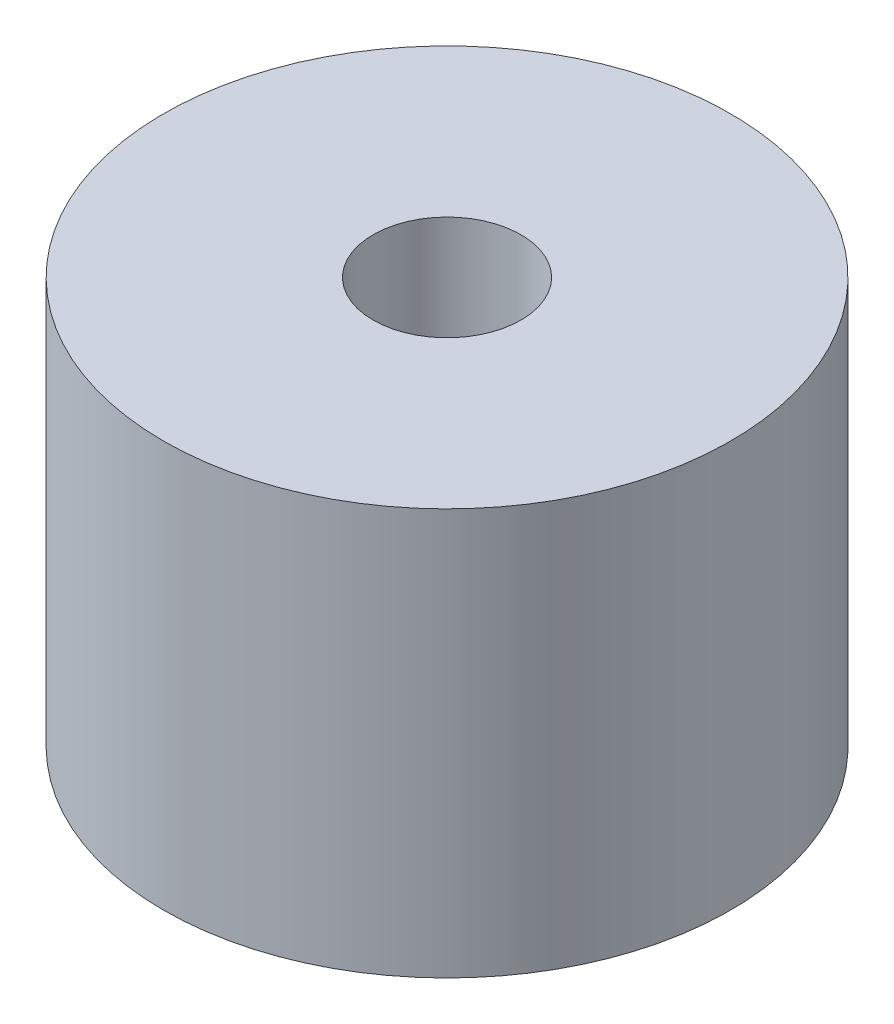
ISO-10303-21;
HEADER;
FILE_DESCRIPTION(('STEP AP214'),'2;1');
FILE_NAME('part.step','',(''),(''),'','','');
FILE_SCHEMA(('AUTOMOTIVE_DESIGN { 1 0 10303 214 1 1 1 1 }'));
ENDSEC;
DATA;
#1=APPLICATION_CONTEXT('core data for automotive mechanical design processes');
#2=APPLICATION_PROTOCOL_DEFINITION('international standard','automotive_design',2000,#1);
#3=PRODUCT_CONTEXT('',#1,'mechanical');
#4=PRODUCT('Part','Part','',(#3));
#5=PRODUCT_RELATED_PRODUCT_CATEGORY('part','',(#4));
#6=PRODUCT_DEFINITION_FORMATION('','',#4);
#7=PRODUCT_DEFINITION_CONTEXT('part definition',#1,'design');
#8=PRODUCT_DEFINITION('design','',#6,#7);
#9=PRODUCT_DEFINITION_SHAPE('','',#8);
#10=(LENGTH_UNIT() NAMED_UNIT(*) SI_UNIT(.MILLI.,.METRE.));
#11=(NAMED_UNIT(*) PLANE_ANGLE_UNIT() SI_UNIT($,.RADIAN.));
#12=(NAMED_UNIT(*) SI_UNIT($,.STERADIAN.) SOLID_ANGLE_UNIT());
#13=UNCERTAINTY_MEASURE_WITH_UNIT(LENGTH_MEASURE(1.E-05),#10,'distance_accuracy_value','');
#14=(GEOMETRIC_REPRESENTATION_CONTEXT(3) GLOBAL_UNCERTAINTY_ASSIGNED_CONTEXT((#13)) GLOBAL_UNIT_ASSIGNED_CONTEXT((#10,
#11,#12)) REPRESENTATION_CONTEXT('',''));
#15=CARTESIAN_POINT('',(0.,0.,0.));
#16=DIRECTION('',(0.,0.,1.));
#17=DIRECTION('',(1.,0.,0.));
#18=AXIS2_PLACEMENT_3D('',#15,#16,#17);
#19=CARTESIAN_POINT('',(0.,8.24,0.));
#20=DIRECTION('',(0.,1.,0.));
#21=DIRECTION('',(0.,0.,1.));
#22=AXIS2_PLACEMENT_3D('',#19,#20,#21);
#23=PLANE('',#22);
#24=CARTESIAN_POINT('',(0.,8.24,0.));
#25=DIRECTION('',(0.,1.,0.));
#26=DIRECTION('',(0.,0.,1.));
#27=AXIS2_PLACEMENT_3D('',#24,#25,#26);
#28=CIRCLE('',#27,5.75);
#29=CARTESIAN_POINT('',(0.,8.24,5.75));
#30=VERTEX_POINT('',#29);
#31=EDGE_CURVE('E10',#30,#30,#28,.T.);
#32=ORIENTED_EDGE('',*,*,#31,.T.);
#33=EDGE_LOOP('',(#32));
#34=FACE_BOUND('',#33,.T.);
#35=CARTESIAN_POINT('',(0.,8.24,0.));
#36=DIRECTION('',(0.,1.,0.));
#37=DIRECTION('',(0.,0.,1.));
#38=AXIS2_PLACEMENT_3D('',#35,#36,#37);
#39=CIRCLE('',#38,1.5);
#40=CARTESIAN_POINT('',(0.,8.24,1.5));
#41=VERTEX_POINT('',#40);
#42=EDGE_CURVE('E50',#41,#41,#39,.T.);
#43=ORIENTED_EDGE('',*,*,#42,.F.);
#44=EDGE_LOOP('',(#43));
#45=FACE_BOUND('',#44,.T.);
#46=ADVANCED_FACE('F37',(#34,#45),#23,.T.);
#47=CARTESIAN_POINT('',(0.,0.,0.));
#48=DIRECTION('',(0.,1.,0.));
#49=DIRECTION('',(0.,0.,1.));
#50=AXIS2_PLACEMENT_3D('',#47,#48,#49);
#51=PLANE('',#50);
#52=CARTESIAN_POINT('',(0.,0.,0.));
#53=DIRECTION('',(0.,1.,0.));
#54=DIRECTION('',(0.,0.,1.));
#55=AXIS2_PLACEMENT_3D('',#52,#53,#54);
#56=CIRCLE('',#55,5.75);
#57=CARTESIAN_POINT('',(0.,0.,5.75));
#58=VERTEX_POINT('',#57);
#59=EDGE_CURVE('E41',#58,#58,#56,.T.);
#60=ORIENTED_EDGE('',*,*,#59,.F.);
#61=EDGE_LOOP('',(#60));
#62=FACE_BOUND('',#61,.T.);
#63=CARTESIAN_POINT('',(0.,0.,0.));
#64=DIRECTION('',(0.,1.,0.));
#65=DIRECTION('',(0.,0.,1.));
#66=AXIS2_PLACEMENT_3D('',#63,#64,#65);
#67=CIRCLE('',#66,1.5);
#68=CARTESIAN_POINT('',(0.,0.,1.5));
#69=VERTEX_POINT('',#68);
#70=EDGE_CURVE('E52',#69,#69,#67,.T.);
#71=ORIENTED_EDGE('',*,*,#70,.T.);
#72=EDGE_LOOP('',(#71));
#73=FACE_BOUND('',#72,.T.);
#74=ADVANCED_FACE('F64',(#62,#73),#51,.F.);
#75=CARTESIAN_POINT('',(0.,8.24,0.));
#76=DIRECTION('',(0.,-1.,0.));
#77=DIRECTION('',(0.,0.,-1.));
#78=AXIS2_PLACEMENT_3D('',#75,#76,#77);
#79=CYLINDRICAL_SURFACE('',#78,5.75);
#80=ORIENTED_EDGE('',*,*,#31,.F.);
#81=EDGE_LOOP('',(#80));
#82=FACE_BOUND('',#81,.T.);
#83=ORIENTED_EDGE('',*,*,#59,.T.);
#84=EDGE_LOOP('',(#83));
#85=FACE_BOUND('',#84,.T.);
#86=ADVANCED_FACE('F39',(#82,#85),#79,.T.);
#87=CARTESIAN_POINT('',(0.,8.24,0.));
#88=DIRECTION('',(0.,-1.,0.));
#89=DIRECTION('',(0.,0.,-1.));
#90=AXIS2_PLACEMENT_3D('',#87,#88,#89);
#91=CYLINDRICAL_SURFACE('',#90,1.5);
#92=ORIENTED_EDGE('',*,*,#42,.T.);
#93=EDGE_LOOP('',(#92));
#94=FACE_BOUND('',#93,.T.);
#95=ORIENTED_EDGE('',*,*,#70,.F.);
#96=EDGE_LOOP('',(#95));
#97=FACE_BOUND('',#96,.T.);
#98=ADVANCED_FACE('F60',(#94,#97),#91,.F.);
#99=CLOSED_SHELL('',(#46,#74,#86,#98));
#100=MANIFOLD_SOLID_BREP('B2',#99);
#101=ADVANCED_BREP_SHAPE_REPRESENTATION('',(#18,#100),#14);
#102=SHAPE_DEFINITION_REPRESENTATION(#9,#101);
ENDSEC;
END-ISO-10303-21;
